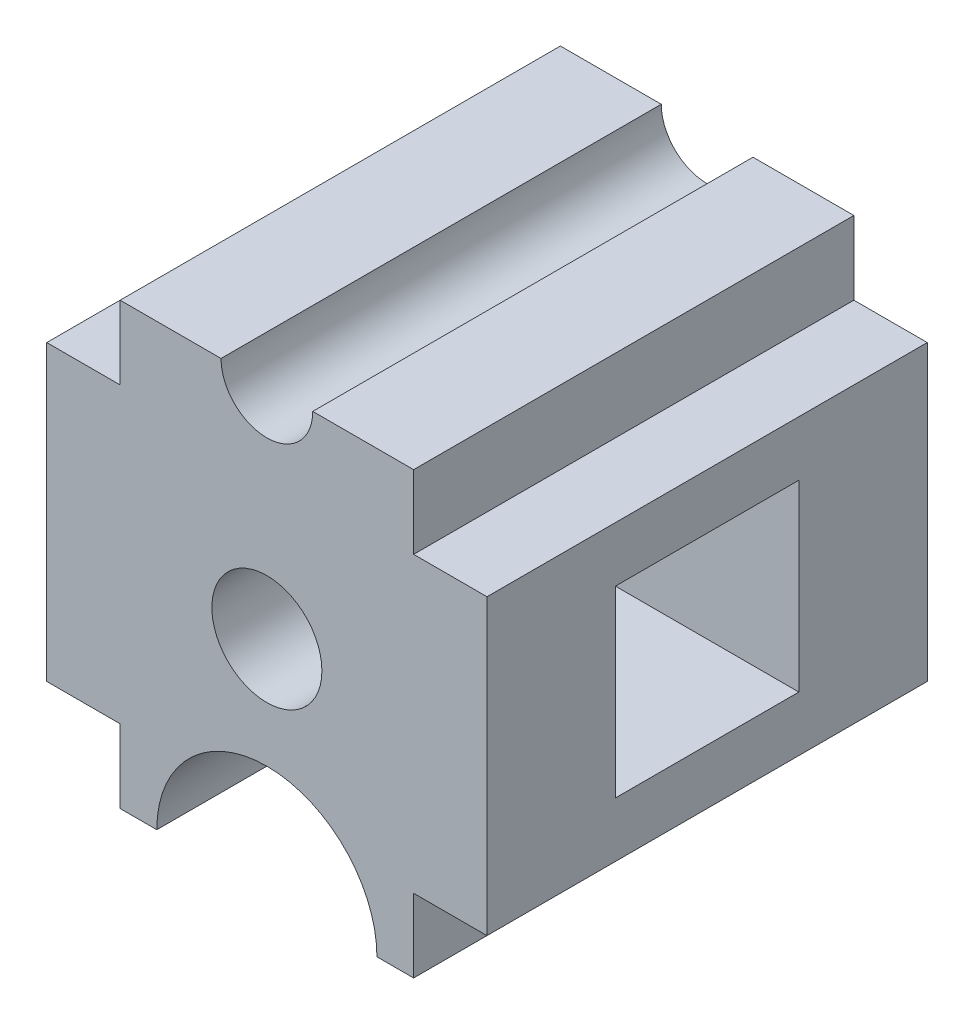
ISO-10303-21;
HEADER;
FILE_DESCRIPTION(('STEP AP214'),'2;1');
FILE_NAME('part.step','',(''),(''),'','','');
FILE_SCHEMA(('AUTOMOTIVE_DESIGN { 1 0 10303 214 1 1 1 1 }'));
ENDSEC;
DATA;
#1=APPLICATION_CONTEXT('core data for automotive mechanical design processes');
#2=APPLICATION_PROTOCOL_DEFINITION('international standard','automotive_design',2000,#1);
#3=PRODUCT_CONTEXT('',#1,'mechanical');
#4=PRODUCT('Part','Part','',(#3));
#5=PRODUCT_RELATED_PRODUCT_CATEGORY('part','',(#4));
#6=PRODUCT_DEFINITION_FORMATION('','',#4);
#7=PRODUCT_DEFINITION_CONTEXT('part definition',#1,'design');
#8=PRODUCT_DEFINITION('design','',#6,#7);
#9=PRODUCT_DEFINITION_SHAPE('','',#8);
#10=(LENGTH_UNIT() NAMED_UNIT(*) SI_UNIT(.MILLI.,.METRE.));
#11=(NAMED_UNIT(*) PLANE_ANGLE_UNIT() SI_UNIT($,.RADIAN.));
#12=(NAMED_UNIT(*) SI_UNIT($,.STERADIAN.) SOLID_ANGLE_UNIT());
#13=UNCERTAINTY_MEASURE_WITH_UNIT(LENGTH_MEASURE(1.E-05),#10,'distance_accuracy_value','');
#14=(GEOMETRIC_REPRESENTATION_CONTEXT(3) GLOBAL_UNCERTAINTY_ASSIGNED_CONTEXT((#13)) GLOBAL_UNIT_ASSIGNED_CONTEXT((#10,
#11,#12)) REPRESENTATION_CONTEXT('',''));
#15=CARTESIAN_POINT('',(0.,0.,0.));
#16=DIRECTION('',(0.,0.,1.));
#17=DIRECTION('',(1.,0.,0.));
#18=AXIS2_PLACEMENT_3D('',#15,#16,#17);
#19=CARTESIAN_POINT('',(0.,0.,0.));
#20=DIRECTION('',(0.,0.,1.));
#21=DIRECTION('',(1.,0.,0.));
#22=AXIS2_PLACEMENT_3D('',#19,#20,#21);
#23=CYLINDRICAL_SURFACE('',#22,15.);
#24=CARTESIAN_POINT('',(0.,0.,35.));
#25=DIRECTION('',(0.,0.,-1.));
#26=DIRECTION('',(0.,1.,0.));
#27=AXIS2_PLACEMENT_3D('',#24,#25,#26);
#28=CIRCLE('',#27,15.);
#29=CARTESIAN_POINT('',(0.,15.,35.));
#30=VERTEX_POINT('',#29);
#31=EDGE_CURVE('E41',#30,#30,#28,.F.);
#32=ORIENTED_EDGE('',*,*,#31,.T.);
#33=EDGE_LOOP('',(#32));
#34=FACE_BOUND('',#33,.T.);
#35=CARTESIAN_POINT('',(0.,0.,0.));
#36=DIRECTION('',(0.,0.,1.));
#37=DIRECTION('',(1.,0.,0.));
#38=AXIS2_PLACEMENT_3D('',#35,#36,#37);
#39=CIRCLE('',#38,15.);
#40=CARTESIAN_POINT('',(15.,0.,0.));
#41=VERTEX_POINT('',#40);
#42=EDGE_CURVE('E260',#41,#41,#39,.T.);
#43=ORIENTED_EDGE('',*,*,#42,.F.);
#44=EDGE_LOOP('',(#43));
#45=FACE_BOUND('',#44,.T.);
#46=ADVANCED_FACE('F37',(#34,#45),#23,.F.);
#47=CARTESIAN_POINT('',(-60.,60.,120.));
#48=DIRECTION('',(0.,-1.,0.));
#49=DIRECTION('',(0.,0.,-1.));
#50=AXIS2_PLACEMENT_3D('',#47,#48,#49);
#51=PLANE('',#50);
#52=DIRECTION('',(0.,0.,1.));
#53=VECTOR('',#52,1.);
#54=CARTESIAN_POINT('',(-40.,60.,0.));
#55=LINE('',#54,#53);
#56=CARTESIAN_POINT('',(-40.,60.,0.));
#57=VERTEX_POINT('',#56);
#58=CARTESIAN_POINT('',(-40.,60.,120.));
#59=VERTEX_POINT('',#58);
#60=EDGE_CURVE('E229',#57,#59,#55,.T.);
#61=ORIENTED_EDGE('',*,*,#60,.T.);
#62=DIRECTION('',(-1.,0.,0.));
#63=VECTOR('',#62,1.);
#64=CARTESIAN_POINT('',(-60.,60.,120.));
#65=LINE('',#64,#63);
#66=CARTESIAN_POINT('',(-12.5,60.,120.));
#67=VERTEX_POINT('',#66);
#68=EDGE_CURVE('E317',#67,#59,#65,.T.);
#69=ORIENTED_EDGE('',*,*,#68,.F.);
#70=DIRECTION('',(0.,0.,1.));
#71=VECTOR('',#70,1.);
#72=CARTESIAN_POINT('',(-12.5,60.,0.));
#73=LINE('',#72,#71);
#74=CARTESIAN_POINT('',(-12.5,60.,0.));
#75=VERTEX_POINT('',#74);
#76=EDGE_CURVE('E223',#75,#67,#73,.T.);
#77=ORIENTED_EDGE('',*,*,#76,.F.);
#78=DIRECTION('',(-1.,0.,0.));
#79=VECTOR('',#78,1.);
#80=CARTESIAN_POINT('',(-60.,60.,0.));
#81=LINE('',#80,#79);
#82=EDGE_CURVE('E327',#75,#57,#81,.T.);
#83=ORIENTED_EDGE('',*,*,#82,.T.);
#84=EDGE_LOOP('',(#61,#69,#77,#83));
#85=FACE_BOUND('',#84,.T.);
#86=ADVANCED_FACE('F357',(#85),#51,.F.);
#87=CARTESIAN_POINT('',(40.,60.,0.));
#88=VERTEX_POINT('',#87);
#89=CARTESIAN_POINT('',(12.5,60.,0.));
#90=VERTEX_POINT('',#89);
#91=EDGE_CURVE('E330',#88,#90,#81,.T.);
#92=ORIENTED_EDGE('',*,*,#91,.T.);
#93=DIRECTION('',(0.,0.,1.));
#94=VECTOR('',#93,1.);
#95=CARTESIAN_POINT('',(12.5,60.,0.));
#96=LINE('',#95,#94);
#97=CARTESIAN_POINT('',(12.5,60.,120.));
#98=VERTEX_POINT('',#97);
#99=EDGE_CURVE('E236',#90,#98,#96,.T.);
#100=ORIENTED_EDGE('',*,*,#99,.T.);
#101=CARTESIAN_POINT('',(40.,60.,120.));
#102=VERTEX_POINT('',#101);
#103=EDGE_CURVE('E321',#102,#98,#65,.T.);
#104=ORIENTED_EDGE('',*,*,#103,.F.);
#105=DIRECTION('',(0.,0.,1.));
#106=VECTOR('',#105,1.);
#107=CARTESIAN_POINT('',(40.,60.,0.));
#108=LINE('',#107,#106);
#109=EDGE_CURVE('E250',#88,#102,#108,.T.);
#110=ORIENTED_EDGE('',*,*,#109,.F.);
#111=EDGE_LOOP('',(#92,#100,#104,#110));
#112=FACE_BOUND('',#111,.T.);
#113=ADVANCED_FACE('F363',(#112),#51,.F.);
#114=CARTESIAN_POINT('',(-60.,60.,120.));
#115=DIRECTION('',(1.,0.,0.));
#116=DIRECTION('',(0.,1.,0.));
#117=AXIS2_PLACEMENT_3D('',#114,#115,#116);
#118=PLANE('',#117);
#119=DIRECTION('',(0.,0.,-1.));
#120=VECTOR('',#119,1.);
#121=CARTESIAN_POINT('',(-60.,-25.,85.));
#122=LINE('',#121,#120);
#123=CARTESIAN_POINT('',(-60.,-25.,85.));
#124=VERTEX_POINT('',#123);
#125=CARTESIAN_POINT('',(-60.,-25.,35.));
#126=VERTEX_POINT('',#125);
#127=EDGE_CURVE('E185',#124,#126,#122,.T.);
#128=ORIENTED_EDGE('',*,*,#127,.T.);
#129=DIRECTION('',(0.,1.,0.));
#130=VECTOR('',#129,1.);
#131=CARTESIAN_POINT('',(-60.,25.,35.));
#132=LINE('',#131,#130);
#133=CARTESIAN_POINT('',(-60.,25.,35.));
#134=VERTEX_POINT('',#133);
#135=EDGE_CURVE('E179',#126,#134,#132,.T.);
#136=ORIENTED_EDGE('',*,*,#135,.T.);
#137=DIRECTION('',(0.,0.,1.));
#138=VECTOR('',#137,1.);
#139=CARTESIAN_POINT('',(-60.,25.,85.));
#140=LINE('',#139,#138);
#141=CARTESIAN_POINT('',(-60.,25.,85.));
#142=VERTEX_POINT('',#141);
#143=EDGE_CURVE('E188',#134,#142,#140,.T.);
#144=ORIENTED_EDGE('',*,*,#143,.T.);
#145=DIRECTION('',(0.,-1.,0.));
#146=VECTOR('',#145,1.);
#147=CARTESIAN_POINT('',(-60.,25.,85.));
#148=LINE('',#147,#146);
#149=EDGE_CURVE('E54',#142,#124,#148,.T.);
#150=ORIENTED_EDGE('',*,*,#149,.T.);
#151=EDGE_LOOP('',(#128,#136,#144,#150));
#152=FACE_BOUND('',#151,.T.);
#153=DIRECTION('',(0.,0.,1.));
#154=VECTOR('',#153,1.);
#155=CARTESIAN_POINT('',(-60.,40.,0.));
#156=LINE('',#155,#154);
#157=CARTESIAN_POINT('',(-60.,40.,0.));
#158=VERTEX_POINT('',#157);
#159=CARTESIAN_POINT('',(-60.,40.,120.));
#160=VERTEX_POINT('',#159);
#161=EDGE_CURVE('E226',#158,#160,#156,.T.);
#162=ORIENTED_EDGE('',*,*,#161,.F.);
#163=DIRECTION('',(0.,-1.,0.));
#164=VECTOR('',#163,1.);
#165=CARTESIAN_POINT('',(-60.,60.,0.));
#166=LINE('',#165,#164);
#167=CARTESIAN_POINT('',(-60.,-40.,0.));
#168=VERTEX_POINT('',#167);
#169=EDGE_CURVE('E331',#158,#168,#166,.T.);
#170=ORIENTED_EDGE('',*,*,#169,.T.);
#171=DIRECTION('',(0.,0.,1.));
#172=VECTOR('',#171,1.);
#173=CARTESIAN_POINT('',(-60.,-40.,0.));
#174=LINE('',#173,#172);
#175=CARTESIAN_POINT('',(-60.,-40.,120.));
#176=VERTEX_POINT('',#175);
#177=EDGE_CURVE('E293',#168,#176,#174,.T.);
#178=ORIENTED_EDGE('',*,*,#177,.T.);
#179=DIRECTION('',(0.,-1.,0.));
#180=VECTOR('',#179,1.);
#181=CARTESIAN_POINT('',(-60.,60.,120.));
#182=LINE('',#181,#180);
#183=EDGE_CURVE('E322',#160,#176,#182,.T.);
#184=ORIENTED_EDGE('',*,*,#183,.F.);
#185=EDGE_LOOP('',(#162,#170,#178,#184));
#186=FACE_BOUND('',#185,.T.);
#187=ADVANCED_FACE('F192',(#152,#186),#118,.F.);
#188=CARTESIAN_POINT('',(0.,0.,120.));
#189=DIRECTION('',(0.,0.,1.));
#190=DIRECTION('',(1.,0.,0.));
#191=AXIS2_PLACEMENT_3D('',#188,#189,#190);
#192=PLANE('',#191);
#193=CARTESIAN_POINT('',(0.,0.,120.));
#194=DIRECTION('',(0.,0.,1.));
#195=DIRECTION('',(1.,0.,0.));
#196=AXIS2_PLACEMENT_3D('',#193,#194,#195);
#197=CIRCLE('',#196,15.);
#198=CARTESIAN_POINT('',(15.,0.,120.));
#199=VERTEX_POINT('',#198);
#200=EDGE_CURVE('E228',#199,#199,#197,.T.);
#201=ORIENTED_EDGE('',*,*,#200,.F.);
#202=EDGE_LOOP('',(#201));
#203=FACE_BOUND('',#202,.T.);
#204=DIRECTION('',(0.,-1.,0.));
#205=VECTOR('',#204,1.);
#206=CARTESIAN_POINT('',(-40.,0.,120.));
#207=LINE('',#206,#205);
#208=CARTESIAN_POINT('',(-40.,40.,120.));
#209=VERTEX_POINT('',#208);
#210=EDGE_CURVE('E217',#59,#209,#207,.T.);
#211=ORIENTED_EDGE('',*,*,#210,.T.);
#212=DIRECTION('',(-1.,0.,0.));
#213=VECTOR('',#212,1.);
#214=CARTESIAN_POINT('',(0.,40.,120.));
#215=LINE('',#214,#213);
#216=EDGE_CURVE('E220',#209,#160,#215,.T.);
#217=ORIENTED_EDGE('',*,*,#216,.T.);
#218=ORIENTED_EDGE('',*,*,#183,.T.);
#219=DIRECTION('',(-1.,0.,0.));
#220=VECTOR('',#219,1.);
#221=CARTESIAN_POINT('',(-40.,-40.,120.));
#222=LINE('',#221,#220);
#223=CARTESIAN_POINT('',(-40.,-40.,120.));
#224=VERTEX_POINT('',#223);
#225=EDGE_CURVE('E263',#224,#176,#222,.T.);
#226=ORIENTED_EDGE('',*,*,#225,.F.);
#227=DIRECTION('',(0.,1.,0.));
#228=VECTOR('',#227,1.);
#229=CARTESIAN_POINT('',(-40.,-60.,120.));
#230=LINE('',#229,#228);
#231=CARTESIAN_POINT('',(-40.,-60.,120.));
#232=VERTEX_POINT('',#231);
#233=EDGE_CURVE('E290',#232,#224,#230,.T.);
#234=ORIENTED_EDGE('',*,*,#233,.F.);
#235=DIRECTION('',(1.,0.,0.));
#236=VECTOR('',#235,1.);
#237=CARTESIAN_POINT('',(-60.,-60.,120.));
#238=LINE('',#237,#236);
#239=CARTESIAN_POINT('',(-30.,-60.,120.));
#240=VERTEX_POINT('',#239);
#241=EDGE_CURVE('E11',#232,#240,#238,.T.);
#242=ORIENTED_EDGE('',*,*,#241,.T.);
#243=CARTESIAN_POINT('',(0.,-60.,120.));
#244=DIRECTION('',(0.,0.,1.));
#245=DIRECTION('',(1.,0.,0.));
#246=AXIS2_PLACEMENT_3D('',#243,#244,#245);
#247=CIRCLE('',#246,30.);
#248=CARTESIAN_POINT('',(30.,-60.,120.));
#249=VERTEX_POINT('',#248);
#250=EDGE_CURVE('E282',#249,#240,#247,.T.);
#251=ORIENTED_EDGE('',*,*,#250,.F.);
#252=CARTESIAN_POINT('',(40.,-60.,120.));
#253=VERTEX_POINT('',#252);
#254=EDGE_CURVE('E46',#249,#253,#238,.T.);
#255=ORIENTED_EDGE('',*,*,#254,.T.);
#256=DIRECTION('',(0.,-1.,0.));
#257=VECTOR('',#256,1.);
#258=CARTESIAN_POINT('',(40.,-60.,120.));
#259=LINE('',#258,#257);
#260=CARTESIAN_POINT('',(40.,-40.,120.));
#261=VERTEX_POINT('',#260);
#262=EDGE_CURVE('E270',#261,#253,#259,.T.);
#263=ORIENTED_EDGE('',*,*,#262,.F.);
#264=DIRECTION('',(-1.,0.,0.));
#265=VECTOR('',#264,1.);
#266=CARTESIAN_POINT('',(40.,-40.,120.));
#267=LINE('',#266,#265);
#268=CARTESIAN_POINT('',(60.,-40.,120.));
#269=VERTEX_POINT('',#268);
#270=EDGE_CURVE('E274',#269,#261,#267,.T.);
#271=ORIENTED_EDGE('',*,*,#270,.F.);
#272=DIRECTION('',(0.,1.,0.));
#273=VECTOR('',#272,1.);
#274=CARTESIAN_POINT('',(60.,60.,120.));
#275=LINE('',#274,#273);
#276=CARTESIAN_POINT('',(60.,40.,120.));
#277=VERTEX_POINT('',#276);
#278=EDGE_CURVE('E314',#269,#277,#275,.T.);
#279=ORIENTED_EDGE('',*,*,#278,.T.);
#280=DIRECTION('',(1.,0.,0.));
#281=VECTOR('',#280,1.);
#282=CARTESIAN_POINT('',(0.,40.,120.));
#283=LINE('',#282,#281);
#284=CARTESIAN_POINT('',(40.,40.,120.));
#285=VERTEX_POINT('',#284);
#286=EDGE_CURVE('E247',#285,#277,#283,.T.);
#287=ORIENTED_EDGE('',*,*,#286,.F.);
#288=DIRECTION('',(0.,-1.,0.));
#289=VECTOR('',#288,1.);
#290=CARTESIAN_POINT('',(40.,0.,120.));
#291=LINE('',#290,#289);
#292=EDGE_CURVE('E251',#102,#285,#291,.T.);
#293=ORIENTED_EDGE('',*,*,#292,.F.);
#294=ORIENTED_EDGE('',*,*,#103,.T.);
#295=CARTESIAN_POINT('',(0.,60.,120.));
#296=DIRECTION('',(0.,0.,1.));
#297=DIRECTION('',(1.,0.,0.));
#298=AXIS2_PLACEMENT_3D('',#295,#296,#297);
#299=CIRCLE('',#298,12.5);
#300=EDGE_CURVE('E237',#67,#98,#299,.T.);
#301=ORIENTED_EDGE('',*,*,#300,.F.);
#302=ORIENTED_EDGE('',*,*,#68,.T.);
#303=EDGE_LOOP('',(#211,#217,#218,#226,#234,#242,#251,#255,#263,#271,#279,#287,#293,#294,#301,#302));
#304=FACE_BOUND('',#303,.T.);
#305=ADVANCED_FACE('F383',(#203,#304),#192,.T.);
#306=CARTESIAN_POINT('',(0.,0.,0.));
#307=DIRECTION('',(0.,0.,1.));
#308=DIRECTION('',(1.,0.,0.));
#309=AXIS2_PLACEMENT_3D('',#306,#307,#308);
#310=PLANE('',#309);
#311=ORIENTED_EDGE('',*,*,#42,.T.);
#312=EDGE_LOOP('',(#311));
#313=FACE_BOUND('',#312,.T.);
#314=DIRECTION('',(-1.,0.,0.));
#315=VECTOR('',#314,1.);
#316=CARTESIAN_POINT('',(0.,40.,0.));
#317=LINE('',#316,#315);
#318=CARTESIAN_POINT('',(-40.,40.,0.));
#319=VERTEX_POINT('',#318);
#320=EDGE_CURVE('E214',#319,#158,#317,.T.);
#321=ORIENTED_EDGE('',*,*,#320,.F.);
#322=DIRECTION('',(0.,-1.,0.));
#323=VECTOR('',#322,1.);
#324=CARTESIAN_POINT('',(-40.,0.,0.));
#325=LINE('',#324,#323);
#326=EDGE_CURVE('E216',#57,#319,#325,.T.);
#327=ORIENTED_EDGE('',*,*,#326,.F.);
#328=ORIENTED_EDGE('',*,*,#82,.F.);
#329=CARTESIAN_POINT('',(0.,60.,0.));
#330=DIRECTION('',(0.,0.,1.));
#331=DIRECTION('',(1.,0.,0.));
#332=AXIS2_PLACEMENT_3D('',#329,#330,#331);
#333=CIRCLE('',#332,12.5);
#334=EDGE_CURVE('E233',#75,#90,#333,.T.);
#335=ORIENTED_EDGE('',*,*,#334,.T.);
#336=ORIENTED_EDGE('',*,*,#91,.F.);
#337=DIRECTION('',(0.,-1.,0.));
#338=VECTOR('',#337,1.);
#339=CARTESIAN_POINT('',(40.,0.,0.));
#340=LINE('',#339,#338);
#341=CARTESIAN_POINT('',(40.,40.,0.));
#342=VERTEX_POINT('',#341);
#343=EDGE_CURVE('E243',#88,#342,#340,.T.);
#344=ORIENTED_EDGE('',*,*,#343,.T.);
#345=DIRECTION('',(1.,0.,0.));
#346=VECTOR('',#345,1.);
#347=CARTESIAN_POINT('',(0.,40.,0.));
#348=LINE('',#347,#346);
#349=CARTESIAN_POINT('',(60.,40.,0.));
#350=VERTEX_POINT('',#349);
#351=EDGE_CURVE('E246',#342,#350,#348,.T.);
#352=ORIENTED_EDGE('',*,*,#351,.T.);
#353=DIRECTION('',(0.,1.,0.));
#354=VECTOR('',#353,1.);
#355=CARTESIAN_POINT('',(60.,60.,0.));
#356=LINE('',#355,#354);
#357=CARTESIAN_POINT('',(60.,-40.,0.));
#358=VERTEX_POINT('',#357);
#359=EDGE_CURVE('E313',#358,#350,#356,.T.);
#360=ORIENTED_EDGE('',*,*,#359,.F.);
#361=DIRECTION('',(-1.,0.,0.));
#362=VECTOR('',#361,1.);
#363=CARTESIAN_POINT('',(40.,-40.,0.));
#364=LINE('',#363,#362);
#365=CARTESIAN_POINT('',(40.,-40.,0.));
#366=VERTEX_POINT('',#365);
#367=EDGE_CURVE('E266',#358,#366,#364,.T.);
#368=ORIENTED_EDGE('',*,*,#367,.T.);
#369=DIRECTION('',(0.,-1.,0.));
#370=VECTOR('',#369,1.);
#371=CARTESIAN_POINT('',(40.,-60.,0.));
#372=LINE('',#371,#370);
#373=CARTESIAN_POINT('',(40.,-60.,0.));
#374=VERTEX_POINT('',#373);
#375=EDGE_CURVE('E269',#366,#374,#372,.T.);
#376=ORIENTED_EDGE('',*,*,#375,.T.);
#377=DIRECTION('',(1.,0.,0.));
#378=VECTOR('',#377,1.);
#379=CARTESIAN_POINT('',(-60.,-60.,0.));
#380=LINE('',#379,#378);
#381=CARTESIAN_POINT('',(30.,-60.,0.));
#382=VERTEX_POINT('',#381);
#383=EDGE_CURVE('E333',#382,#374,#380,.T.);
#384=ORIENTED_EDGE('',*,*,#383,.F.);
#385=CARTESIAN_POINT('',(0.,-60.,0.));
#386=DIRECTION('',(0.,0.,1.));
#387=DIRECTION('',(1.,0.,0.));
#388=AXIS2_PLACEMENT_3D('',#385,#386,#387);
#389=CIRCLE('',#388,30.);
#390=CARTESIAN_POINT('',(-30.,-60.,0.));
#391=VERTEX_POINT('',#390);
#392=EDGE_CURVE('E303',#382,#391,#389,.T.);
#393=ORIENTED_EDGE('',*,*,#392,.T.);
#394=CARTESIAN_POINT('',(-40.,-60.,0.));
#395=VERTEX_POINT('',#394);
#396=EDGE_CURVE('E318',#395,#391,#380,.T.);
#397=ORIENTED_EDGE('',*,*,#396,.F.);
#398=DIRECTION('',(0.,1.,0.));
#399=VECTOR('',#398,1.);
#400=CARTESIAN_POINT('',(-40.,-60.,0.));
#401=LINE('',#400,#399);
#402=CARTESIAN_POINT('',(-40.,-40.,0.));
#403=VERTEX_POINT('',#402);
#404=EDGE_CURVE('E289',#395,#403,#401,.T.);
#405=ORIENTED_EDGE('',*,*,#404,.T.);
#406=DIRECTION('',(-1.,0.,0.));
#407=VECTOR('',#406,1.);
#408=CARTESIAN_POINT('',(-40.,-40.,0.));
#409=LINE('',#408,#407);
#410=EDGE_CURVE('E286',#403,#168,#409,.T.);
#411=ORIENTED_EDGE('',*,*,#410,.T.);
#412=ORIENTED_EDGE('',*,*,#169,.F.);
#413=EDGE_LOOP('',(#321,#327,#328,#335,#336,#344,#352,#360,#368,#376,#384,#393,#397,#405,#411,#412));
#414=FACE_BOUND('',#413,.T.);
#415=ADVANCED_FACE('F386',(#313,#414),#310,.F.);
#416=CARTESIAN_POINT('',(-60.,-60.,120.));
#417=DIRECTION('',(0.,1.,0.));
#418=DIRECTION('',(0.,0.,1.));
#419=AXIS2_PLACEMENT_3D('',#416,#417,#418);
#420=PLANE('',#419);
#421=ORIENTED_EDGE('',*,*,#241,.F.);
#422=DIRECTION('',(0.,0.,1.));
#423=VECTOR('',#422,1.);
#424=CARTESIAN_POINT('',(-40.,-60.,0.));
#425=LINE('',#424,#423);
#426=EDGE_CURVE('E299',#395,#232,#425,.T.);
#427=ORIENTED_EDGE('',*,*,#426,.F.);
#428=ORIENTED_EDGE('',*,*,#396,.T.);
#429=DIRECTION('',(0.,0.,1.));
#430=VECTOR('',#429,1.);
#431=CARTESIAN_POINT('',(-30.,-60.,0.));
#432=LINE('',#431,#430);
#433=EDGE_CURVE('E310',#391,#240,#432,.T.);
#434=ORIENTED_EDGE('',*,*,#433,.T.);
#435=EDGE_LOOP('',(#421,#427,#428,#434));
#436=FACE_BOUND('',#435,.T.);
#437=ADVANCED_FACE('F413',(#436),#420,.F.);
#438=CARTESIAN_POINT('',(60.,60.,120.));
#439=DIRECTION('',(-1.,0.,0.));
#440=DIRECTION('',(0.,-1.,0.));
#441=AXIS2_PLACEMENT_3D('',#438,#439,#440);
#442=PLANE('',#441);
#443=DIRECTION('',(0.,0.,1.));
#444=VECTOR('',#443,1.);
#445=CARTESIAN_POINT('',(60.,25.,85.));
#446=LINE('',#445,#444);
#447=CARTESIAN_POINT('',(60.,25.,35.));
#448=VERTEX_POINT('',#447);
#449=CARTESIAN_POINT('',(60.,25.,85.));
#450=VERTEX_POINT('',#449);
#451=EDGE_CURVE('E204',#448,#450,#446,.T.);
#452=ORIENTED_EDGE('',*,*,#451,.F.);
#453=DIRECTION('',(0.,1.,0.));
#454=VECTOR('',#453,1.);
#455=CARTESIAN_POINT('',(60.,25.,35.));
#456=LINE('',#455,#454);
#457=CARTESIAN_POINT('',(60.,-25.,35.));
#458=VERTEX_POINT('',#457);
#459=EDGE_CURVE('E62',#458,#448,#456,.T.);
#460=ORIENTED_EDGE('',*,*,#459,.F.);
#461=DIRECTION('',(0.,0.,-1.));
#462=VECTOR('',#461,1.);
#463=CARTESIAN_POINT('',(60.,-25.,85.));
#464=LINE('',#463,#462);
#465=CARTESIAN_POINT('',(60.,-25.,85.));
#466=VERTEX_POINT('',#465);
#467=EDGE_CURVE('E195',#466,#458,#464,.T.);
#468=ORIENTED_EDGE('',*,*,#467,.F.);
#469=DIRECTION('',(0.,-1.,0.));
#470=VECTOR('',#469,1.);
#471=CARTESIAN_POINT('',(60.,25.,85.));
#472=LINE('',#471,#470);
#473=EDGE_CURVE('E198',#450,#466,#472,.T.);
#474=ORIENTED_EDGE('',*,*,#473,.F.);
#475=EDGE_LOOP('',(#452,#460,#468,#474));
#476=FACE_BOUND('',#475,.T.);
#477=ORIENTED_EDGE('',*,*,#359,.T.);
#478=DIRECTION('',(0.,0.,1.));
#479=VECTOR('',#478,1.);
#480=CARTESIAN_POINT('',(60.,40.,0.));
#481=LINE('',#480,#479);
#482=EDGE_CURVE('E239',#350,#277,#481,.T.);
#483=ORIENTED_EDGE('',*,*,#482,.T.);
#484=ORIENTED_EDGE('',*,*,#278,.F.);
#485=DIRECTION('',(0.,0.,1.));
#486=VECTOR('',#485,1.);
#487=CARTESIAN_POINT('',(60.,-40.,0.));
#488=LINE('',#487,#486);
#489=EDGE_CURVE('E273',#358,#269,#488,.T.);
#490=ORIENTED_EDGE('',*,*,#489,.F.);
#491=EDGE_LOOP('',(#477,#483,#484,#490));
#492=FACE_BOUND('',#491,.T.);
#493=ADVANCED_FACE('F39',(#476,#492),#442,.F.);
#494=ORIENTED_EDGE('',*,*,#383,.T.);
#495=DIRECTION('',(0.,0.,1.));
#496=VECTOR('',#495,1.);
#497=CARTESIAN_POINT('',(40.,-60.,0.));
#498=LINE('',#497,#496);
#499=EDGE_CURVE('E279',#374,#253,#498,.T.);
#500=ORIENTED_EDGE('',*,*,#499,.T.);
#501=ORIENTED_EDGE('',*,*,#254,.F.);
#502=DIRECTION('',(0.,0.,1.));
#503=VECTOR('',#502,1.);
#504=CARTESIAN_POINT('',(30.,-60.,0.));
#505=LINE('',#504,#503);
#506=EDGE_CURVE('E306',#249,#382,#505,.F.);
#507=ORIENTED_EDGE('',*,*,#506,.T.);
#508=EDGE_LOOP('',(#494,#500,#501,#507));
#509=FACE_BOUND('',#508,.T.);
#510=ADVANCED_FACE('F419',(#509),#420,.F.);
#511=CARTESIAN_POINT('',(0.,-60.,0.));
#512=DIRECTION('',(0.,0.,1.));
#513=DIRECTION('',(1.,0.,0.));
#514=AXIS2_PLACEMENT_3D('',#511,#512,#513);
#515=CYLINDRICAL_SURFACE('',#514,30.);
#516=ORIENTED_EDGE('',*,*,#392,.F.);
#517=ORIENTED_EDGE('',*,*,#506,.F.);
#518=ORIENTED_EDGE('',*,*,#250,.T.);
#519=ORIENTED_EDGE('',*,*,#433,.F.);
#520=EDGE_LOOP('',(#516,#517,#518,#519));
#521=FACE_BOUND('',#520,.T.);
#522=ADVANCED_FACE('F416',(#521),#515,.F.);
#523=CARTESIAN_POINT('',(40.,-60.,0.));
#524=DIRECTION('',(-1.,0.,0.));
#525=DIRECTION('',(0.,0.,1.));
#526=AXIS2_PLACEMENT_3D('',#523,#524,#525);
#527=PLANE('',#526);
#528=ORIENTED_EDGE('',*,*,#262,.T.);
#529=ORIENTED_EDGE('',*,*,#499,.F.);
#530=ORIENTED_EDGE('',*,*,#375,.F.);
#531=DIRECTION('',(0.,0.,1.));
#532=VECTOR('',#531,1.);
#533=CARTESIAN_POINT('',(40.,-40.,0.));
#534=LINE('',#533,#532);
#535=EDGE_CURVE('E283',#366,#261,#534,.T.);
#536=ORIENTED_EDGE('',*,*,#535,.T.);
#537=EDGE_LOOP('',(#528,#529,#530,#536));
#538=FACE_BOUND('',#537,.T.);
#539=ADVANCED_FACE('F425',(#538),#527,.F.);
#540=CARTESIAN_POINT('',(40.,-40.,0.));
#541=DIRECTION('',(0.,1.,0.));
#542=DIRECTION('',(0.,0.,1.));
#543=AXIS2_PLACEMENT_3D('',#540,#541,#542);
#544=PLANE('',#543);
#545=ORIENTED_EDGE('',*,*,#270,.T.);
#546=ORIENTED_EDGE('',*,*,#535,.F.);
#547=ORIENTED_EDGE('',*,*,#367,.F.);
#548=ORIENTED_EDGE('',*,*,#489,.T.);
#549=EDGE_LOOP('',(#545,#546,#547,#548));
#550=FACE_BOUND('',#549,.T.);
#551=ADVANCED_FACE('F428',(#550),#544,.F.);
#552=CARTESIAN_POINT('',(-40.,-40.,0.));
#553=DIRECTION('',(0.,1.,0.));
#554=DIRECTION('',(-1.,0.,0.));
#555=AXIS2_PLACEMENT_3D('',#552,#553,#554);
#556=PLANE('',#555);
#557=ORIENTED_EDGE('',*,*,#225,.T.);
#558=ORIENTED_EDGE('',*,*,#177,.F.);
#559=ORIENTED_EDGE('',*,*,#410,.F.);
#560=DIRECTION('',(0.,0.,1.));
#561=VECTOR('',#560,1.);
#562=CARTESIAN_POINT('',(-40.,-40.,0.));
#563=LINE('',#562,#561);
#564=EDGE_CURVE('E277',#403,#224,#563,.T.);
#565=ORIENTED_EDGE('',*,*,#564,.T.);
#566=EDGE_LOOP('',(#557,#558,#559,#565));
#567=FACE_BOUND('',#566,.T.);
#568=ADVANCED_FACE('F377',(#567),#556,.F.);
#569=CARTESIAN_POINT('',(-40.,-60.,0.));
#570=DIRECTION('',(1.,0.,0.));
#571=DIRECTION('',(0.,0.,-1.));
#572=AXIS2_PLACEMENT_3D('',#569,#570,#571);
#573=PLANE('',#572);
#574=ORIENTED_EDGE('',*,*,#233,.T.);
#575=ORIENTED_EDGE('',*,*,#564,.F.);
#576=ORIENTED_EDGE('',*,*,#404,.F.);
#577=ORIENTED_EDGE('',*,*,#426,.T.);
#578=EDGE_LOOP('',(#574,#575,#576,#577));
#579=FACE_BOUND('',#578,.T.);
#580=ADVANCED_FACE('F369',(#579),#573,.F.);
#581=CARTESIAN_POINT('',(0.,0.,85.));
#582=DIRECTION('',(0.,0.,1.));
#583=DIRECTION('',(1.,0.,0.));
#584=AXIS2_PLACEMENT_3D('',#581,#582,#583);
#585=CIRCLE('',#584,15.);
#586=CARTESIAN_POINT('',(15.,0.,85.));
#587=VERTEX_POINT('',#586);
#588=EDGE_CURVE('E210',#587,#587,#585,.F.);
#589=ORIENTED_EDGE('',*,*,#588,.T.);
#590=EDGE_LOOP('',(#589));
#591=FACE_BOUND('',#590,.T.);
#592=ORIENTED_EDGE('',*,*,#200,.T.);
#593=EDGE_LOOP('',(#592));
#594=FACE_BOUND('',#593,.T.);
#595=ADVANCED_FACE('F359',(#591,#594),#23,.F.);
#596=CARTESIAN_POINT('',(0.,40.,0.));
#597=DIRECTION('',(0.,-1.,0.));
#598=DIRECTION('',(1.,0.,0.));
#599=AXIS2_PLACEMENT_3D('',#596,#597,#598);
#600=PLANE('',#599);
#601=ORIENTED_EDGE('',*,*,#286,.T.);
#602=ORIENTED_EDGE('',*,*,#482,.F.);
#603=ORIENTED_EDGE('',*,*,#351,.F.);
#604=DIRECTION('',(0.,0.,1.));
#605=VECTOR('',#604,1.);
#606=CARTESIAN_POINT('',(40.,40.,0.));
#607=LINE('',#606,#605);
#608=EDGE_CURVE('E257',#342,#285,#607,.T.);
#609=ORIENTED_EDGE('',*,*,#608,.T.);
#610=EDGE_LOOP('',(#601,#602,#603,#609));
#611=FACE_BOUND('',#610,.T.);
#612=ADVANCED_FACE('F368',(#611),#600,.F.);
#613=CARTESIAN_POINT('',(40.,0.,0.));
#614=DIRECTION('',(-1.,0.,0.));
#615=DIRECTION('',(0.,-1.,0.));
#616=AXIS2_PLACEMENT_3D('',#613,#614,#615);
#617=PLANE('',#616);
#618=ORIENTED_EDGE('',*,*,#292,.T.);
#619=ORIENTED_EDGE('',*,*,#608,.F.);
#620=ORIENTED_EDGE('',*,*,#343,.F.);
#621=ORIENTED_EDGE('',*,*,#109,.T.);
#622=EDGE_LOOP('',(#618,#619,#620,#621));
#623=FACE_BOUND('',#622,.T.);
#624=ADVANCED_FACE('F374',(#623),#617,.F.);
#625=CARTESIAN_POINT('',(0.,60.,0.));
#626=DIRECTION('',(0.,0.,1.));
#627=DIRECTION('',(1.,0.,0.));
#628=AXIS2_PLACEMENT_3D('',#625,#626,#627);
#629=CYLINDRICAL_SURFACE('',#628,12.5);
#630=ORIENTED_EDGE('',*,*,#300,.T.);
#631=ORIENTED_EDGE('',*,*,#99,.F.);
#632=ORIENTED_EDGE('',*,*,#334,.F.);
#633=ORIENTED_EDGE('',*,*,#76,.T.);
#634=EDGE_LOOP('',(#630,#631,#632,#633));
#635=FACE_BOUND('',#634,.T.);
#636=ADVANCED_FACE('F441',(#635),#629,.F.);
#637=CARTESIAN_POINT('',(0.,40.,0.));
#638=DIRECTION('',(0.,1.,0.));
#639=DIRECTION('',(0.,0.,1.));
#640=AXIS2_PLACEMENT_3D('',#637,#638,#639);
#641=PLANE('',#640);
#642=ORIENTED_EDGE('',*,*,#216,.F.);
#643=DIRECTION('',(0.,0.,1.));
#644=VECTOR('',#643,1.);
#645=CARTESIAN_POINT('',(-40.,40.,0.));
#646=LINE('',#645,#644);
#647=EDGE_CURVE('E219',#319,#209,#646,.T.);
#648=ORIENTED_EDGE('',*,*,#647,.F.);
#649=ORIENTED_EDGE('',*,*,#320,.T.);
#650=ORIENTED_EDGE('',*,*,#161,.T.);
#651=EDGE_LOOP('',(#642,#648,#649,#650));
#652=FACE_BOUND('',#651,.T.);
#653=ADVANCED_FACE('F352',(#652),#641,.T.);
#654=CARTESIAN_POINT('',(-40.,0.,0.));
#655=DIRECTION('',(-1.,0.,0.));
#656=DIRECTION('',(0.,0.,1.));
#657=AXIS2_PLACEMENT_3D('',#654,#655,#656);
#658=PLANE('',#657);
#659=ORIENTED_EDGE('',*,*,#210,.F.);
#660=ORIENTED_EDGE('',*,*,#60,.F.);
#661=ORIENTED_EDGE('',*,*,#326,.T.);
#662=ORIENTED_EDGE('',*,*,#647,.T.);
#663=EDGE_LOOP('',(#659,#660,#661,#662));
#664=FACE_BOUND('',#663,.T.);
#665=ADVANCED_FACE('F344',(#664),#658,.T.);
#666=CARTESIAN_POINT('',(-60.,25.,35.));
#667=DIRECTION('',(0.,0.,-1.));
#668=DIRECTION('',(0.,1.,0.));
#669=AXIS2_PLACEMENT_3D('',#666,#667,#668);
#670=PLANE('',#669);
#671=ORIENTED_EDGE('',*,*,#459,.T.);
#672=DIRECTION('',(1.,0.,0.));
#673=VECTOR('',#672,1.);
#674=CARTESIAN_POINT('',(-60.,25.,35.));
#675=LINE('',#674,#673);
#676=EDGE_CURVE('E174',#134,#448,#675,.T.);
#677=ORIENTED_EDGE('',*,*,#676,.F.);
#678=ORIENTED_EDGE('',*,*,#135,.F.);
#679=DIRECTION('',(1.,0.,0.));
#680=VECTOR('',#679,1.);
#681=CARTESIAN_POINT('',(-60.,-25.,35.));
#682=LINE('',#681,#680);
#683=EDGE_CURVE('E208',#126,#458,#682,.T.);
#684=ORIENTED_EDGE('',*,*,#683,.T.);
#685=EDGE_LOOP('',(#671,#677,#678,#684));
#686=FACE_BOUND('',#685,.T.);
#687=ORIENTED_EDGE('',*,*,#31,.F.);
#688=EDGE_LOOP('',(#687));
#689=FACE_BOUND('',#688,.T.);
#690=ADVANCED_FACE('F176',(#686,#689),#670,.F.);
#691=CARTESIAN_POINT('',(-60.,25.,85.));
#692=DIRECTION('',(0.,0.,1.));
#693=DIRECTION('',(1.,0.,0.));
#694=AXIS2_PLACEMENT_3D('',#691,#692,#693);
#695=PLANE('',#694);
#696=ORIENTED_EDGE('',*,*,#473,.T.);
#697=DIRECTION('',(1.,0.,0.));
#698=VECTOR('',#697,1.);
#699=CARTESIAN_POINT('',(-60.,-25.,85.));
#700=LINE('',#699,#698);
#701=EDGE_CURVE('E211',#124,#466,#700,.T.);
#702=ORIENTED_EDGE('',*,*,#701,.F.);
#703=ORIENTED_EDGE('',*,*,#149,.F.);
#704=DIRECTION('',(1.,0.,0.));
#705=VECTOR('',#704,1.);
#706=CARTESIAN_POINT('',(-60.,25.,85.));
#707=LINE('',#706,#705);
#708=EDGE_CURVE('E184',#142,#450,#707,.T.);
#709=ORIENTED_EDGE('',*,*,#708,.T.);
#710=EDGE_LOOP('',(#696,#702,#703,#709));
#711=FACE_BOUND('',#710,.T.);
#712=ORIENTED_EDGE('',*,*,#588,.F.);
#713=EDGE_LOOP('',(#712));
#714=FACE_BOUND('',#713,.T.);
#715=ADVANCED_FACE('F343',(#711,#714),#695,.F.);
#716=CARTESIAN_POINT('',(-60.,-25.,85.));
#717=DIRECTION('',(0.,-1.,0.));
#718=DIRECTION('',(1.,0.,0.));
#719=AXIS2_PLACEMENT_3D('',#716,#717,#718);
#720=PLANE('',#719);
#721=ORIENTED_EDGE('',*,*,#467,.T.);
#722=ORIENTED_EDGE('',*,*,#683,.F.);
#723=ORIENTED_EDGE('',*,*,#127,.F.);
#724=ORIENTED_EDGE('',*,*,#701,.T.);
#725=EDGE_LOOP('',(#721,#722,#723,#724));
#726=FACE_BOUND('',#725,.T.);
#727=ADVANCED_FACE('F350',(#726),#720,.F.);
#728=CARTESIAN_POINT('',(-60.,25.,85.));
#729=DIRECTION('',(0.,1.,0.));
#730=DIRECTION('',(-1.,0.,0.));
#731=AXIS2_PLACEMENT_3D('',#728,#729,#730);
#732=PLANE('',#731);
#733=ORIENTED_EDGE('',*,*,#451,.T.);
#734=ORIENTED_EDGE('',*,*,#708,.F.);
#735=ORIENTED_EDGE('',*,*,#143,.F.);
#736=ORIENTED_EDGE('',*,*,#676,.T.);
#737=EDGE_LOOP('',(#733,#734,#735,#736));
#738=FACE_BOUND('',#737,.T.);
#739=ADVANCED_FACE('F189',(#738),#732,.F.);
#740=CLOSED_SHELL('',(#46,#86,#113,#187,#305,#415,#437,#493,#510,#522,#539,#551,#568,#580,#595,
#612,#624,#636,#653,#665,#690,#715,#727,#739));
#741=MANIFOLD_SOLID_BREP('B2',#740);
#742=ADVANCED_BREP_SHAPE_REPRESENTATION('',(#18,#741),#14);
#743=SHAPE_DEFINITION_REPRESENTATION(#9,#742);
ENDSEC;
END-ISO-10303-21;
